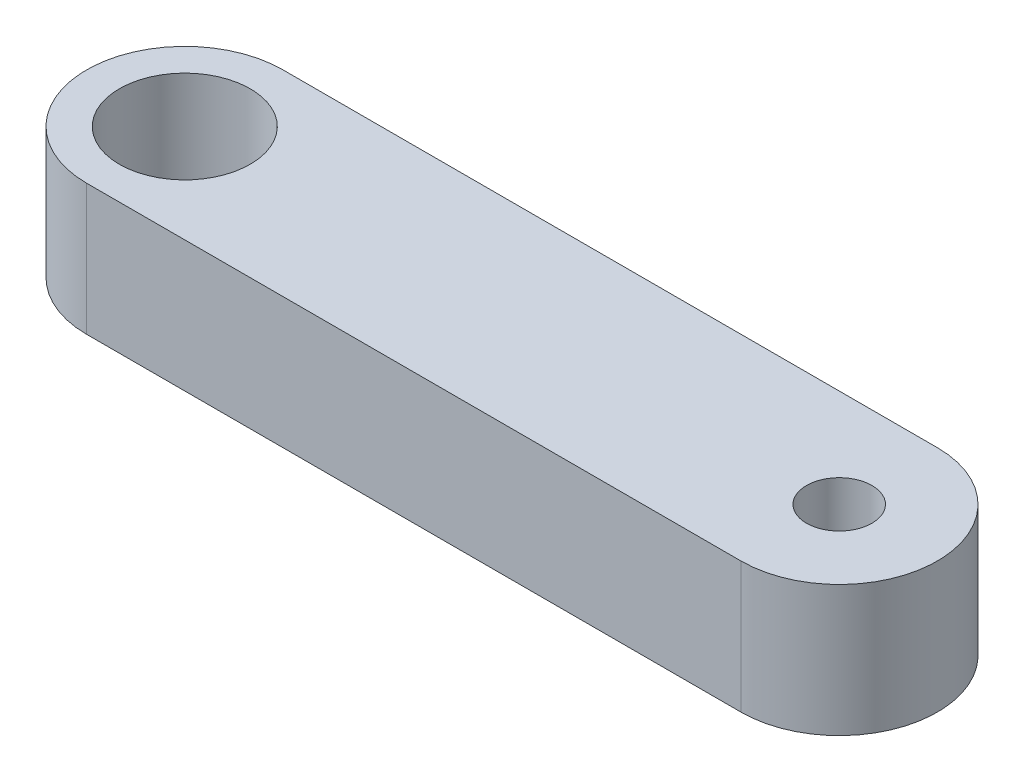
ISO-10303-21;
HEADER;
FILE_DESCRIPTION(('STEP AP214'),'2;1');
FILE_NAME('part.step','',(''),(''),'','','');
FILE_SCHEMA(('AUTOMOTIVE_DESIGN { 1 0 10303 214 1 1 1 1 }'));
ENDSEC;
DATA;
#1=APPLICATION_CONTEXT('core data for automotive mechanical design processes');
#2=APPLICATION_PROTOCOL_DEFINITION('international standard','automotive_design',2000,#1);
#3=PRODUCT_CONTEXT('',#1,'mechanical');
#4=PRODUCT('Part','Part','',(#3));
#5=PRODUCT_RELATED_PRODUCT_CATEGORY('part','',(#4));
#6=PRODUCT_DEFINITION_FORMATION('','',#4);
#7=PRODUCT_DEFINITION_CONTEXT('part definition',#1,'design');
#8=PRODUCT_DEFINITION('design','',#6,#7);
#9=PRODUCT_DEFINITION_SHAPE('','',#8);
#10=(LENGTH_UNIT() NAMED_UNIT(*) SI_UNIT(.MILLI.,.METRE.));
#11=(NAMED_UNIT(*) PLANE_ANGLE_UNIT() SI_UNIT($,.RADIAN.));
#12=(NAMED_UNIT(*) SI_UNIT($,.STERADIAN.) SOLID_ANGLE_UNIT());
#13=UNCERTAINTY_MEASURE_WITH_UNIT(LENGTH_MEASURE(1.E-05),#10,'distance_accuracy_value','');
#14=(GEOMETRIC_REPRESENTATION_CONTEXT(3) GLOBAL_UNCERTAINTY_ASSIGNED_CONTEXT((#13)) GLOBAL_UNIT_ASSIGNED_CONTEXT((#10,
#11,#12)) REPRESENTATION_CONTEXT('',''));
#15=CARTESIAN_POINT('',(0.,0.,0.));
#16=DIRECTION('',(0.,0.,1.));
#17=DIRECTION('',(1.,0.,0.));
#18=AXIS2_PLACEMENT_3D('',#15,#16,#17);
#19=CARTESIAN_POINT('',(0.,10.,-7.5));
#20=DIRECTION('',(0.,1.,0.));
#21=DIRECTION('',(0.,0.,1.));
#22=AXIS2_PLACEMENT_3D('',#19,#20,#21);
#23=PLANE('',#22);
#24=CARTESIAN_POINT('',(50.,10.,-7.5));
#25=DIRECTION('',(0.,1.,0.));
#26=DIRECTION('',(0.,0.,1.));
#27=AXIS2_PLACEMENT_3D('',#24,#25,#26);
#28=CIRCLE('',#27,2.5);
#29=CARTESIAN_POINT('',(50.,10.,-5.));
#30=VERTEX_POINT('',#29);
#31=EDGE_CURVE('E100',#30,#30,#28,.T.);
#32=ORIENTED_EDGE('',*,*,#31,.F.);
#33=EDGE_LOOP('',(#32));
#34=FACE_BOUND('',#33,.T.);
#35=CARTESIAN_POINT('',(0.,10.,-7.5));
#36=DIRECTION('',(0.,1.,0.));
#37=DIRECTION('',(0.,0.,1.));
#38=AXIS2_PLACEMENT_3D('',#35,#36,#37);
#39=CIRCLE('',#38,7.5);
#40=CARTESIAN_POINT('',(0.,10.,-15.));
#41=VERTEX_POINT('',#40);
#42=CARTESIAN_POINT('',(0.,10.,0.));
#43=VERTEX_POINT('',#42);
#44=EDGE_CURVE('E85',#41,#43,#39,.T.);
#45=ORIENTED_EDGE('',*,*,#44,.T.);
#46=DIRECTION('',(1.,0.,0.));
#47=VECTOR('',#46,1.);
#48=CARTESIAN_POINT('',(0.,10.,0.));
#49=LINE('',#48,#47);
#50=CARTESIAN_POINT('',(50.,10.,0.));
#51=VERTEX_POINT('',#50);
#52=EDGE_CURVE('E80',#43,#51,#49,.T.);
#53=ORIENTED_EDGE('',*,*,#52,.T.);
#54=CARTESIAN_POINT('',(50.,10.,-7.5));
#55=DIRECTION('',(0.,1.,0.));
#56=DIRECTION('',(0.,0.,1.));
#57=AXIS2_PLACEMENT_3D('',#54,#55,#56);
#58=CIRCLE('',#57,7.5);
#59=CARTESIAN_POINT('',(50.,10.,-15.));
#60=VERTEX_POINT('',#59);
#61=EDGE_CURVE('E83',#51,#60,#58,.T.);
#62=ORIENTED_EDGE('',*,*,#61,.T.);
#63=DIRECTION('',(-1.,0.,0.));
#64=VECTOR('',#63,1.);
#65=CARTESIAN_POINT('',(0.,10.,-15.));
#66=LINE('',#65,#64);
#67=EDGE_CURVE('E50',#60,#41,#66,.T.);
#68=ORIENTED_EDGE('',*,*,#67,.T.);
#69=EDGE_LOOP('',(#45,#53,#62,#68));
#70=FACE_BOUND('',#69,.T.);
#71=CARTESIAN_POINT('',(0.,10.,-7.5));
#72=DIRECTION('',(0.,1.,0.));
#73=DIRECTION('',(0.,0.,1.));
#74=AXIS2_PLACEMENT_3D('',#71,#72,#73);
#75=CIRCLE('',#74,5.);
#76=CARTESIAN_POINT('',(0.,10.,-2.5));
#77=VERTEX_POINT('',#76);
#78=EDGE_CURVE('E115',#77,#77,#75,.T.);
#79=ORIENTED_EDGE('',*,*,#78,.F.);
#80=EDGE_LOOP('',(#79));
#81=FACE_BOUND('',#80,.T.);
#82=ADVANCED_FACE('F33',(#34,#70,#81),#23,.T.);
#83=CARTESIAN_POINT('',(0.,0.,-7.5));
#84=DIRECTION('',(0.,1.,0.));
#85=DIRECTION('',(0.,0.,1.));
#86=AXIS2_PLACEMENT_3D('',#83,#84,#85);
#87=PLANE('',#86);
#88=CARTESIAN_POINT('',(0.,0.,-7.5));
#89=DIRECTION('',(0.,1.,0.));
#90=DIRECTION('',(0.,0.,1.));
#91=AXIS2_PLACEMENT_3D('',#88,#89,#90);
#92=CIRCLE('',#91,7.5);
#93=CARTESIAN_POINT('',(0.,0.,-15.));
#94=VERTEX_POINT('',#93);
#95=CARTESIAN_POINT('',(0.,0.,0.));
#96=VERTEX_POINT('',#95);
#97=EDGE_CURVE('E97',#94,#96,#92,.T.);
#98=ORIENTED_EDGE('',*,*,#97,.F.);
#99=DIRECTION('',(-1.,0.,0.));
#100=VECTOR('',#99,1.);
#101=CARTESIAN_POINT('',(0.,0.,-15.));
#102=LINE('',#101,#100);
#103=CARTESIAN_POINT('',(50.,0.,-15.));
#104=VERTEX_POINT('',#103);
#105=EDGE_CURVE('E73',#104,#94,#102,.T.);
#106=ORIENTED_EDGE('',*,*,#105,.F.);
#107=CARTESIAN_POINT('',(50.,0.,-7.5));
#108=DIRECTION('',(0.,1.,0.));
#109=DIRECTION('',(0.,0.,1.));
#110=AXIS2_PLACEMENT_3D('',#107,#108,#109);
#111=CIRCLE('',#110,7.5);
#112=CARTESIAN_POINT('',(50.,0.,0.));
#113=VERTEX_POINT('',#112);
#114=EDGE_CURVE('E67',#113,#104,#111,.T.);
#115=ORIENTED_EDGE('',*,*,#114,.F.);
#116=DIRECTION('',(1.,0.,0.));
#117=VECTOR('',#116,1.);
#118=CARTESIAN_POINT('',(0.,0.,0.));
#119=LINE('',#118,#117);
#120=EDGE_CURVE('E89',#96,#113,#119,.T.);
#121=ORIENTED_EDGE('',*,*,#120,.F.);
#122=EDGE_LOOP('',(#98,#106,#115,#121));
#123=FACE_BOUND('',#122,.T.);
#124=CARTESIAN_POINT('',(50.,0.,-7.5));
#125=DIRECTION('',(0.,1.,0.));
#126=DIRECTION('',(0.,0.,1.));
#127=AXIS2_PLACEMENT_3D('',#124,#125,#126);
#128=CIRCLE('',#127,2.5);
#129=CARTESIAN_POINT('',(50.,0.,-5.));
#130=VERTEX_POINT('',#129);
#131=EDGE_CURVE('E112',#130,#130,#128,.T.);
#132=ORIENTED_EDGE('',*,*,#131,.T.);
#133=EDGE_LOOP('',(#132));
#134=FACE_BOUND('',#133,.T.);
#135=CARTESIAN_POINT('',(0.,0.,-7.5));
#136=DIRECTION('',(0.,1.,0.));
#137=DIRECTION('',(0.,0.,1.));
#138=AXIS2_PLACEMENT_3D('',#135,#136,#137);
#139=CIRCLE('',#138,5.);
#140=CARTESIAN_POINT('',(0.,0.,-2.5));
#141=VERTEX_POINT('',#140);
#142=EDGE_CURVE('E118',#141,#141,#139,.T.);
#143=ORIENTED_EDGE('',*,*,#142,.T.);
#144=EDGE_LOOP('',(#143));
#145=FACE_BOUND('',#144,.T.);
#146=ADVANCED_FACE('F108',(#123,#134,#145),#87,.F.);
#147=CARTESIAN_POINT('',(0.,10.,-7.5));
#148=DIRECTION('',(0.,-1.,0.));
#149=DIRECTION('',(0.,0.,-1.));
#150=AXIS2_PLACEMENT_3D('',#147,#148,#149);
#151=CYLINDRICAL_SURFACE('',#150,7.5);
#152=ORIENTED_EDGE('',*,*,#97,.T.);
#153=DIRECTION('',(0.,-1.,0.));
#154=VECTOR('',#153,1.);
#155=CARTESIAN_POINT('',(0.,10.,0.));
#156=LINE('',#155,#154);
#157=EDGE_CURVE('E11',#43,#96,#156,.T.);
#158=ORIENTED_EDGE('',*,*,#157,.F.);
#159=ORIENTED_EDGE('',*,*,#44,.F.);
#160=DIRECTION('',(0.,-1.,0.));
#161=VECTOR('',#160,1.);
#162=CARTESIAN_POINT('',(0.,10.,-15.));
#163=LINE('',#162,#161);
#164=EDGE_CURVE('E93',#41,#94,#163,.T.);
#165=ORIENTED_EDGE('',*,*,#164,.T.);
#166=EDGE_LOOP('',(#152,#158,#159,#165));
#167=FACE_BOUND('',#166,.T.);
#168=ADVANCED_FACE('F35',(#167),#151,.T.);
#169=CARTESIAN_POINT('',(0.,10.,0.));
#170=DIRECTION('',(0.,0.,-1.));
#171=DIRECTION('',(-1.,0.,0.));
#172=AXIS2_PLACEMENT_3D('',#169,#170,#171);
#173=PLANE('',#172);
#174=ORIENTED_EDGE('',*,*,#120,.T.);
#175=DIRECTION('',(0.,-1.,0.));
#176=VECTOR('',#175,1.);
#177=CARTESIAN_POINT('',(50.,10.,0.));
#178=LINE('',#177,#176);
#179=EDGE_CURVE('E42',#51,#113,#178,.T.);
#180=ORIENTED_EDGE('',*,*,#179,.F.);
#181=ORIENTED_EDGE('',*,*,#52,.F.);
#182=ORIENTED_EDGE('',*,*,#157,.T.);
#183=EDGE_LOOP('',(#174,#180,#181,#182));
#184=FACE_BOUND('',#183,.T.);
#185=ADVANCED_FACE('F88',(#184),#173,.F.);
#186=CARTESIAN_POINT('',(50.,10.,-7.5));
#187=DIRECTION('',(0.,-1.,0.));
#188=DIRECTION('',(0.,0.,-1.));
#189=AXIS2_PLACEMENT_3D('',#186,#187,#188);
#190=CYLINDRICAL_SURFACE('',#189,7.5);
#191=ORIENTED_EDGE('',*,*,#114,.T.);
#192=DIRECTION('',(0.,-1.,0.));
#193=VECTOR('',#192,1.);
#194=CARTESIAN_POINT('',(50.,10.,-15.));
#195=LINE('',#194,#193);
#196=EDGE_CURVE('E90',#60,#104,#195,.T.);
#197=ORIENTED_EDGE('',*,*,#196,.F.);
#198=ORIENTED_EDGE('',*,*,#61,.F.);
#199=ORIENTED_EDGE('',*,*,#179,.T.);
#200=EDGE_LOOP('',(#191,#197,#198,#199));
#201=FACE_BOUND('',#200,.T.);
#202=ADVANCED_FACE('F91',(#201),#190,.T.);
#203=CARTESIAN_POINT('',(0.,10.,-15.));
#204=DIRECTION('',(0.,0.,1.));
#205=DIRECTION('',(1.,0.,0.));
#206=AXIS2_PLACEMENT_3D('',#203,#204,#205);
#207=PLANE('',#206);
#208=ORIENTED_EDGE('',*,*,#105,.T.);
#209=ORIENTED_EDGE('',*,*,#164,.F.);
#210=ORIENTED_EDGE('',*,*,#67,.F.);
#211=ORIENTED_EDGE('',*,*,#196,.T.);
#212=EDGE_LOOP('',(#208,#209,#210,#211));
#213=FACE_BOUND('',#212,.T.);
#214=ADVANCED_FACE('F105',(#213),#207,.F.);
#215=CARTESIAN_POINT('',(50.,10.,-7.5));
#216=DIRECTION('',(0.,-1.,0.));
#217=DIRECTION('',(0.,0.,-1.));
#218=AXIS2_PLACEMENT_3D('',#215,#216,#217);
#219=CYLINDRICAL_SURFACE('',#218,2.5);
#220=ORIENTED_EDGE('',*,*,#31,.T.);
#221=EDGE_LOOP('',(#220));
#222=FACE_BOUND('',#221,.T.);
#223=ORIENTED_EDGE('',*,*,#131,.F.);
#224=EDGE_LOOP('',(#223));
#225=FACE_BOUND('',#224,.T.);
#226=ADVANCED_FACE('F135',(#222,#225),#219,.F.);
#227=CARTESIAN_POINT('',(0.,10.,-7.5));
#228=DIRECTION('',(0.,-1.,0.));
#229=DIRECTION('',(0.,0.,-1.));
#230=AXIS2_PLACEMENT_3D('',#227,#228,#229);
#231=CYLINDRICAL_SURFACE('',#230,5.);
#232=ORIENTED_EDGE('',*,*,#78,.T.);
#233=EDGE_LOOP('',(#232));
#234=FACE_BOUND('',#233,.T.);
#235=ORIENTED_EDGE('',*,*,#142,.F.);
#236=EDGE_LOOP('',(#235));
#237=FACE_BOUND('',#236,.T.);
#238=ADVANCED_FACE('F124',(#234,#237),#231,.F.);
#239=CLOSED_SHELL('',(#82,#146,#168,#185,#202,#214,#226,#238));
#240=MANIFOLD_SOLID_BREP('B2',#239);
#241=ADVANCED_BREP_SHAPE_REPRESENTATION('',(#18,#240),#14);
#242=SHAPE_DEFINITION_REPRESENTATION(#9,#241);
ENDSEC;
END-ISO-10303-21;
